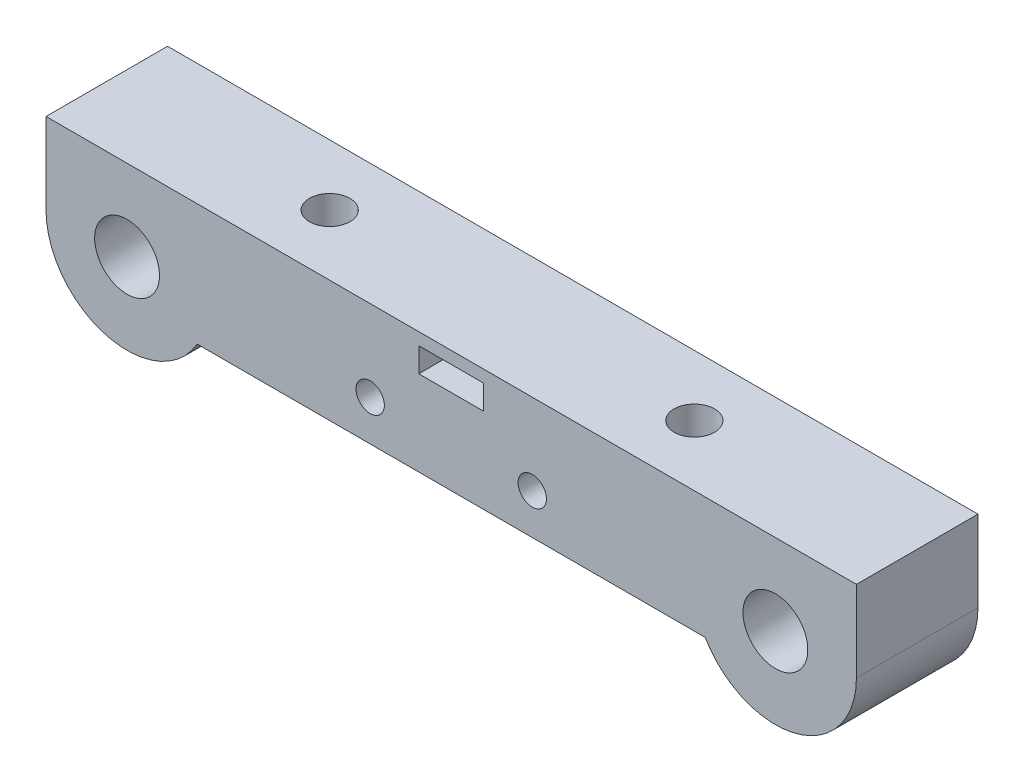
ISO-10303-21;
HEADER;
FILE_DESCRIPTION(('STEP AP214'),'2;1');
FILE_NAME('part.step','',(''),(''),'','','');
FILE_SCHEMA(('AUTOMOTIVE_DESIGN { 1 0 10303 214 1 1 1 1 }'));
ENDSEC;
DATA;
#1=APPLICATION_CONTEXT('core data for automotive mechanical design processes');
#2=APPLICATION_PROTOCOL_DEFINITION('international standard','automotive_design',2000,#1);
#3=PRODUCT_CONTEXT('',#1,'mechanical');
#4=PRODUCT('Part','Part','',(#3));
#5=PRODUCT_RELATED_PRODUCT_CATEGORY('part','',(#4));
#6=PRODUCT_DEFINITION_FORMATION('','',#4);
#7=PRODUCT_DEFINITION_CONTEXT('part definition',#1,'design');
#8=PRODUCT_DEFINITION('design','',#6,#7);
#9=PRODUCT_DEFINITION_SHAPE('','',#8);
#10=(LENGTH_UNIT() NAMED_UNIT(*) SI_UNIT(.MILLI.,.METRE.));
#11=(NAMED_UNIT(*) PLANE_ANGLE_UNIT() SI_UNIT($,.RADIAN.));
#12=(NAMED_UNIT(*) SI_UNIT($,.STERADIAN.) SOLID_ANGLE_UNIT());
#13=UNCERTAINTY_MEASURE_WITH_UNIT(LENGTH_MEASURE(1.E-05),#10,'distance_accuracy_value','');
#14=(GEOMETRIC_REPRESENTATION_CONTEXT(3) GLOBAL_UNCERTAINTY_ASSIGNED_CONTEXT((#13)) GLOBAL_UNIT_ASSIGNED_CONTEXT((#10,
#11,#12)) REPRESENTATION_CONTEXT('',''));
#15=CARTESIAN_POINT('',(0.,0.,0.));
#16=DIRECTION('',(0.,0.,1.));
#17=DIRECTION('',(1.,0.,0.));
#18=AXIS2_PLACEMENT_3D('',#15,#16,#17);
#19=CARTESIAN_POINT('',(40.,-9.99999999999999,15.));
#20=DIRECTION('',(0.,0.,-1.));
#21=DIRECTION('',(-1.,0.,0.));
#22=AXIS2_PLACEMENT_3D('',#19,#20,#21);
#23=PLANE('',#22);
#24=DIRECTION('',(-1.,0.,0.));
#25=VECTOR('',#24,1.);
#26=CARTESIAN_POINT('',(-50.,0.,15.));
#27=LINE('',#26,#25);
#28=CARTESIAN_POINT('',(50.,0.,15.));
#29=VERTEX_POINT('',#28);
#30=CARTESIAN_POINT('',(-50.,0.,15.));
#31=VERTEX_POINT('',#30);
#32=EDGE_CURVE('E149',#29,#31,#27,.T.);
#33=ORIENTED_EDGE('',*,*,#32,.T.);
#34=DIRECTION('',(0.,-1.,0.));
#35=VECTOR('',#34,1.);
#36=CARTESIAN_POINT('',(-50.,-10.,15.));
#37=LINE('',#36,#35);
#38=CARTESIAN_POINT('',(-50.,-10.,15.));
#39=VERTEX_POINT('',#38);
#40=EDGE_CURVE('E152',#31,#39,#37,.T.);
#41=ORIENTED_EDGE('',*,*,#40,.T.);
#42=CARTESIAN_POINT('',(-40.,-10.,15.));
#43=DIRECTION('',(0.,0.,1.));
#44=DIRECTION('',(1.,0.,0.));
#45=AXIS2_PLACEMENT_3D('',#42,#43,#44);
#46=CIRCLE('',#45,10.);
#47=CARTESIAN_POINT('',(-31.3397459621556,-15.,15.));
#48=VERTEX_POINT('',#47);
#49=EDGE_CURVE('E155',#39,#48,#46,.T.);
#50=ORIENTED_EDGE('',*,*,#49,.T.);
#51=DIRECTION('',(1.,0.,0.));
#52=VECTOR('',#51,1.);
#53=CARTESIAN_POINT('',(-31.3397459621556,-15.,15.));
#54=LINE('',#53,#52);
#55=CARTESIAN_POINT('',(31.3397459621556,-15.,15.));
#56=VERTEX_POINT('',#55);
#57=EDGE_CURVE('E157',#48,#56,#54,.T.);
#58=ORIENTED_EDGE('',*,*,#57,.T.);
#59=CARTESIAN_POINT('',(40.,-9.99999999999999,15.));
#60=DIRECTION('',(0.,0.,1.));
#61=DIRECTION('',(-1.,0.,0.));
#62=AXIS2_PLACEMENT_3D('',#59,#60,#61);
#63=CIRCLE('',#62,10.);
#64=CARTESIAN_POINT('',(50.,-9.99999999999999,15.));
#65=VERTEX_POINT('',#64);
#66=EDGE_CURVE('E159',#56,#65,#63,.T.);
#67=ORIENTED_EDGE('',*,*,#66,.T.);
#68=DIRECTION('',(0.,1.,0.));
#69=VECTOR('',#68,1.);
#70=CARTESIAN_POINT('',(50.,0.,15.));
#71=LINE('',#70,#69);
#72=EDGE_CURVE('E161',#65,#29,#71,.T.);
#73=ORIENTED_EDGE('',*,*,#72,.T.);
#74=EDGE_LOOP('',(#33,#41,#50,#58,#67,#73));
#75=FACE_BOUND('',#74,.T.);
#76=DIRECTION('',(0.,-1.,0.));
#77=VECTOR('',#76,1.);
#78=CARTESIAN_POINT('',(-4.,-1.5,15.));
#79=LINE('',#78,#77);
#80=CARTESIAN_POINT('',(-4.,-1.5,15.));
#81=VERTEX_POINT('',#80);
#82=CARTESIAN_POINT('',(-4.,-4.5,15.));
#83=VERTEX_POINT('',#82);
#84=EDGE_CURVE('E110',#81,#83,#79,.T.);
#85=ORIENTED_EDGE('',*,*,#84,.F.);
#86=DIRECTION('',(-1.,0.,0.));
#87=VECTOR('',#86,1.);
#88=CARTESIAN_POINT('',(4.,-1.5,15.));
#89=LINE('',#88,#87);
#90=CARTESIAN_POINT('',(4.,-1.5,15.));
#91=VERTEX_POINT('',#90);
#92=EDGE_CURVE('E133',#91,#81,#89,.T.);
#93=ORIENTED_EDGE('',*,*,#92,.F.);
#94=DIRECTION('',(0.,1.,0.));
#95=VECTOR('',#94,1.);
#96=CARTESIAN_POINT('',(4.,-1.5,15.));
#97=LINE('',#96,#95);
#98=CARTESIAN_POINT('',(4.,-4.5,15.));
#99=VERTEX_POINT('',#98);
#100=EDGE_CURVE('E131',#99,#91,#97,.T.);
#101=ORIENTED_EDGE('',*,*,#100,.F.);
#102=DIRECTION('',(1.,0.,0.));
#103=VECTOR('',#102,1.);
#104=CARTESIAN_POINT('',(4.,-4.5,15.));
#105=LINE('',#104,#103);
#106=EDGE_CURVE('E118',#83,#99,#105,.T.);
#107=ORIENTED_EDGE('',*,*,#106,.F.);
#108=EDGE_LOOP('',(#85,#93,#101,#107));
#109=FACE_BOUND('',#108,.T.);
#110=CARTESIAN_POINT('',(-40.,-10.,15.));
#111=DIRECTION('',(0.,0.,1.));
#112=DIRECTION('',(1.,0.,0.));
#113=AXIS2_PLACEMENT_3D('',#110,#111,#112);
#114=CIRCLE('',#113,4.);
#115=CARTESIAN_POINT('',(-36.,-10.,15.));
#116=VERTEX_POINT('',#115);
#117=EDGE_CURVE('E139',#116,#116,#114,.T.);
#118=ORIENTED_EDGE('',*,*,#117,.F.);
#119=EDGE_LOOP('',(#118));
#120=FACE_BOUND('',#119,.T.);
#121=CARTESIAN_POINT('',(40.,-9.99999999999999,15.));
#122=DIRECTION('',(0.,0.,1.));
#123=DIRECTION('',(-1.,0.,0.));
#124=AXIS2_PLACEMENT_3D('',#121,#122,#123);
#125=CIRCLE('',#124,4.);
#126=CARTESIAN_POINT('',(36.,-9.99999999999999,15.));
#127=VERTEX_POINT('',#126);
#128=EDGE_CURVE('E297',#127,#127,#125,.T.);
#129=ORIENTED_EDGE('',*,*,#128,.F.);
#130=EDGE_LOOP('',(#129));
#131=FACE_BOUND('',#130,.T.);
#132=CARTESIAN_POINT('',(10.,-10.,15.));
#133=DIRECTION('',(0.,0.,1.));
#134=DIRECTION('',(1.,0.,0.));
#135=AXIS2_PLACEMENT_3D('',#132,#133,#134);
#136=CIRCLE('',#135,1.75);
#137=CARTESIAN_POINT('',(11.75,-10.,15.));
#138=VERTEX_POINT('',#137);
#139=EDGE_CURVE('E291',#138,#138,#136,.T.);
#140=ORIENTED_EDGE('',*,*,#139,.F.);
#141=EDGE_LOOP('',(#140));
#142=FACE_BOUND('',#141,.T.);
#143=CARTESIAN_POINT('',(-10.,-10.,15.));
#144=DIRECTION('',(0.,0.,1.));
#145=DIRECTION('',(1.,0.,0.));
#146=AXIS2_PLACEMENT_3D('',#143,#144,#145);
#147=CIRCLE('',#146,1.75);
#148=CARTESIAN_POINT('',(-8.25,-10.,15.));
#149=VERTEX_POINT('',#148);
#150=EDGE_CURVE('E285',#149,#149,#147,.T.);
#151=ORIENTED_EDGE('',*,*,#150,.F.);
#152=EDGE_LOOP('',(#151));
#153=FACE_BOUND('',#152,.T.);
#154=ADVANCED_FACE('F33',(#75,#109,#120,#131,#142,#153),#23,.F.);
#155=CARTESIAN_POINT('',(40.,-9.99999999999999,0.));
#156=DIRECTION('',(0.,0.,-1.));
#157=DIRECTION('',(-1.,0.,0.));
#158=AXIS2_PLACEMENT_3D('',#155,#156,#157);
#159=PLANE('',#158);
#160=CARTESIAN_POINT('',(10.,-10.,0.));
#161=DIRECTION('',(0.,0.,1.));
#162=DIRECTION('',(1.,0.,0.));
#163=AXIS2_PLACEMENT_3D('',#160,#161,#162);
#164=CIRCLE('',#163,1.75);
#165=CARTESIAN_POINT('',(11.75,-10.,0.));
#166=VERTEX_POINT('',#165);
#167=EDGE_CURVE('E288',#166,#166,#164,.T.);
#168=ORIENTED_EDGE('',*,*,#167,.T.);
#169=EDGE_LOOP('',(#168));
#170=FACE_BOUND('',#169,.T.);
#171=CARTESIAN_POINT('',(-40.,-10.,0.));
#172=DIRECTION('',(0.,0.,1.));
#173=DIRECTION('',(1.,0.,0.));
#174=AXIS2_PLACEMENT_3D('',#171,#172,#173);
#175=CIRCLE('',#174,4.);
#176=CARTESIAN_POINT('',(-36.,-10.,0.));
#177=VERTEX_POINT('',#176);
#178=EDGE_CURVE('E300',#177,#177,#175,.T.);
#179=ORIENTED_EDGE('',*,*,#178,.T.);
#180=EDGE_LOOP('',(#179));
#181=FACE_BOUND('',#180,.T.);
#182=DIRECTION('',(-1.,0.,0.));
#183=VECTOR('',#182,1.);
#184=CARTESIAN_POINT('',(-50.,0.,0.));
#185=LINE('',#184,#183);
#186=CARTESIAN_POINT('',(50.,0.,0.));
#187=VERTEX_POINT('',#186);
#188=CARTESIAN_POINT('',(-50.,0.,0.));
#189=VERTEX_POINT('',#188);
#190=EDGE_CURVE('E126',#187,#189,#185,.T.);
#191=ORIENTED_EDGE('',*,*,#190,.F.);
#192=DIRECTION('',(0.,1.,0.));
#193=VECTOR('',#192,1.);
#194=CARTESIAN_POINT('',(50.,0.,0.));
#195=LINE('',#194,#193);
#196=CARTESIAN_POINT('',(50.,-9.99999999999999,0.));
#197=VERTEX_POINT('',#196);
#198=EDGE_CURVE('E153',#197,#187,#195,.T.);
#199=ORIENTED_EDGE('',*,*,#198,.F.);
#200=CARTESIAN_POINT('',(40.,-9.99999999999999,0.));
#201=DIRECTION('',(0.,0.,1.));
#202=DIRECTION('',(-1.,0.,0.));
#203=AXIS2_PLACEMENT_3D('',#200,#201,#202);
#204=CIRCLE('',#203,10.);
#205=CARTESIAN_POINT('',(31.3397459621556,-15.,0.));
#206=VERTEX_POINT('',#205);
#207=EDGE_CURVE('E172',#206,#197,#204,.T.);
#208=ORIENTED_EDGE('',*,*,#207,.F.);
#209=DIRECTION('',(1.,0.,0.));
#210=VECTOR('',#209,1.);
#211=CARTESIAN_POINT('',(-31.3397459621556,-15.,0.));
#212=LINE('',#211,#210);
#213=CARTESIAN_POINT('',(-31.3397459621556,-15.,0.));
#214=VERTEX_POINT('',#213);
#215=EDGE_CURVE('E170',#214,#206,#212,.T.);
#216=ORIENTED_EDGE('',*,*,#215,.F.);
#217=CARTESIAN_POINT('',(-40.,-10.,0.));
#218=DIRECTION('',(0.,0.,1.));
#219=DIRECTION('',(1.,0.,0.));
#220=AXIS2_PLACEMENT_3D('',#217,#218,#219);
#221=CIRCLE('',#220,10.);
#222=CARTESIAN_POINT('',(-50.,-10.,0.));
#223=VERTEX_POINT('',#222);
#224=EDGE_CURVE('E168',#223,#214,#221,.T.);
#225=ORIENTED_EDGE('',*,*,#224,.F.);
#226=DIRECTION('',(0.,-1.,0.));
#227=VECTOR('',#226,1.);
#228=CARTESIAN_POINT('',(-50.,-10.,0.));
#229=LINE('',#228,#227);
#230=EDGE_CURVE('E166',#189,#223,#229,.T.);
#231=ORIENTED_EDGE('',*,*,#230,.F.);
#232=EDGE_LOOP('',(#191,#199,#208,#216,#225,#231));
#233=FACE_BOUND('',#232,.T.);
#234=DIRECTION('',(-1.,0.,0.));
#235=VECTOR('',#234,1.);
#236=CARTESIAN_POINT('',(4.,-1.5,0.));
#237=LINE('',#236,#235);
#238=CARTESIAN_POINT('',(4.,-1.5,0.));
#239=VERTEX_POINT('',#238);
#240=CARTESIAN_POINT('',(-4.,-1.5,0.));
#241=VERTEX_POINT('',#240);
#242=EDGE_CURVE('E119',#239,#241,#237,.T.);
#243=ORIENTED_EDGE('',*,*,#242,.T.);
#244=DIRECTION('',(0.,-1.,0.));
#245=VECTOR('',#244,1.);
#246=CARTESIAN_POINT('',(-4.,-1.5,0.));
#247=LINE('',#246,#245);
#248=CARTESIAN_POINT('',(-4.,-4.5,0.));
#249=VERTEX_POINT('',#248);
#250=EDGE_CURVE('E56',#241,#249,#247,.T.);
#251=ORIENTED_EDGE('',*,*,#250,.T.);
#252=DIRECTION('',(1.,0.,0.));
#253=VECTOR('',#252,1.);
#254=CARTESIAN_POINT('',(4.,-4.5,0.));
#255=LINE('',#254,#253);
#256=CARTESIAN_POINT('',(4.,-4.5,0.));
#257=VERTEX_POINT('',#256);
#258=EDGE_CURVE('E125',#249,#257,#255,.T.);
#259=ORIENTED_EDGE('',*,*,#258,.T.);
#260=DIRECTION('',(0.,1.,0.));
#261=VECTOR('',#260,1.);
#262=CARTESIAN_POINT('',(4.,-1.5,0.));
#263=LINE('',#262,#261);
#264=EDGE_CURVE('E141',#257,#239,#263,.T.);
#265=ORIENTED_EDGE('',*,*,#264,.T.);
#266=EDGE_LOOP('',(#243,#251,#259,#265));
#267=FACE_BOUND('',#266,.T.);
#268=CARTESIAN_POINT('',(40.,-9.99999999999999,0.));
#269=DIRECTION('',(0.,0.,1.));
#270=DIRECTION('',(-1.,0.,0.));
#271=AXIS2_PLACEMENT_3D('',#268,#269,#270);
#272=CIRCLE('',#271,4.);
#273=CARTESIAN_POINT('',(36.,-9.99999999999999,0.));
#274=VERTEX_POINT('',#273);
#275=EDGE_CURVE('E294',#274,#274,#272,.T.);
#276=ORIENTED_EDGE('',*,*,#275,.T.);
#277=EDGE_LOOP('',(#276));
#278=FACE_BOUND('',#277,.T.);
#279=CARTESIAN_POINT('',(-10.,-10.,0.));
#280=DIRECTION('',(0.,0.,1.));
#281=DIRECTION('',(1.,0.,0.));
#282=AXIS2_PLACEMENT_3D('',#279,#280,#281);
#283=CIRCLE('',#282,1.75);
#284=CARTESIAN_POINT('',(-8.25,-10.,0.));
#285=VERTEX_POINT('',#284);
#286=EDGE_CURVE('E283',#285,#285,#283,.T.);
#287=ORIENTED_EDGE('',*,*,#286,.T.);
#288=EDGE_LOOP('',(#287));
#289=FACE_BOUND('',#288,.T.);
#290=ADVANCED_FACE('F196',(#170,#181,#233,#267,#278,#289),#159,.T.);
#291=CARTESIAN_POINT('',(-50.,0.,15.));
#292=DIRECTION('',(0.,-1.,0.));
#293=DIRECTION('',(1.,0.,0.));
#294=AXIS2_PLACEMENT_3D('',#291,#292,#293);
#295=PLANE('',#294);
#296=CARTESIAN_POINT('',(-22.5,0.,7.5));
#297=DIRECTION('',(0.,-1.,0.));
#298=DIRECTION('',(1.,0.,0.));
#299=AXIS2_PLACEMENT_3D('',#296,#297,#298);
#300=CIRCLE('',#299,2.5);
#301=CARTESIAN_POINT('',(-20.,0.,7.5));
#302=VERTEX_POINT('',#301);
#303=EDGE_CURVE('E270',#302,#302,#300,.T.);
#304=ORIENTED_EDGE('',*,*,#303,.T.);
#305=EDGE_LOOP('',(#304));
#306=FACE_BOUND('',#305,.T.);
#307=CARTESIAN_POINT('',(22.5,0.,7.5));
#308=DIRECTION('',(0.,-1.,0.));
#309=DIRECTION('',(1.,0.,0.));
#310=AXIS2_PLACEMENT_3D('',#307,#308,#309);
#311=CIRCLE('',#310,2.5);
#312=CARTESIAN_POINT('',(25.,0.,7.5));
#313=VERTEX_POINT('',#312);
#314=EDGE_CURVE('E278',#313,#313,#311,.F.);
#315=ORIENTED_EDGE('',*,*,#314,.F.);
#316=EDGE_LOOP('',(#315));
#317=FACE_BOUND('',#316,.T.);
#318=ORIENTED_EDGE('',*,*,#190,.T.);
#319=DIRECTION('',(0.,0.,-1.));
#320=VECTOR('',#319,1.);
#321=CARTESIAN_POINT('',(-50.,0.,15.));
#322=LINE('',#321,#320);
#323=EDGE_CURVE('E11',#31,#189,#322,.T.);
#324=ORIENTED_EDGE('',*,*,#323,.F.);
#325=ORIENTED_EDGE('',*,*,#32,.F.);
#326=DIRECTION('',(0.,0.,-1.));
#327=VECTOR('',#326,1.);
#328=CARTESIAN_POINT('',(50.,0.,15.));
#329=LINE('',#328,#327);
#330=EDGE_CURVE('E163',#29,#187,#329,.T.);
#331=ORIENTED_EDGE('',*,*,#330,.T.);
#332=EDGE_LOOP('',(#318,#324,#325,#331));
#333=FACE_BOUND('',#332,.T.);
#334=ADVANCED_FACE('F35',(#306,#317,#333),#295,.F.);
#335=CARTESIAN_POINT('',(-50.,-10.,15.));
#336=DIRECTION('',(1.,0.,0.));
#337=DIRECTION('',(0.,0.,-1.));
#338=AXIS2_PLACEMENT_3D('',#335,#336,#337);
#339=PLANE('',#338);
#340=ORIENTED_EDGE('',*,*,#230,.T.);
#341=DIRECTION('',(0.,0.,-1.));
#342=VECTOR('',#341,1.);
#343=CARTESIAN_POINT('',(-50.,-10.,15.));
#344=LINE('',#343,#342);
#345=EDGE_CURVE('E41',#39,#223,#344,.T.);
#346=ORIENTED_EDGE('',*,*,#345,.F.);
#347=ORIENTED_EDGE('',*,*,#40,.F.);
#348=ORIENTED_EDGE('',*,*,#323,.T.);
#349=EDGE_LOOP('',(#340,#346,#347,#348));
#350=FACE_BOUND('',#349,.T.);
#351=ADVANCED_FACE('F213',(#350),#339,.F.);
#352=CARTESIAN_POINT('',(-40.,-10.,15.));
#353=DIRECTION('',(0.,0.,-1.));
#354=DIRECTION('',(-1.,0.,0.));
#355=AXIS2_PLACEMENT_3D('',#352,#353,#354);
#356=CYLINDRICAL_SURFACE('',#355,10.);
#357=ORIENTED_EDGE('',*,*,#224,.T.);
#358=DIRECTION('',(0.,0.,-1.));
#359=VECTOR('',#358,1.);
#360=CARTESIAN_POINT('',(-31.3397459621556,-15.,15.));
#361=LINE('',#360,#359);
#362=EDGE_CURVE('E183',#48,#214,#361,.T.);
#363=ORIENTED_EDGE('',*,*,#362,.F.);
#364=ORIENTED_EDGE('',*,*,#49,.F.);
#365=ORIENTED_EDGE('',*,*,#345,.T.);
#366=EDGE_LOOP('',(#357,#363,#364,#365));
#367=FACE_BOUND('',#366,.T.);
#368=ADVANCED_FACE('F190',(#367),#356,.T.);
#369=CARTESIAN_POINT('',(-31.3397459621556,-15.,15.));
#370=DIRECTION('',(0.,1.,0.));
#371=DIRECTION('',(-1.,0.,0.));
#372=AXIS2_PLACEMENT_3D('',#369,#370,#371);
#373=PLANE('',#372);
#374=CARTESIAN_POINT('',(-22.5,-15.,7.5));
#375=DIRECTION('',(0.,-1.,0.));
#376=DIRECTION('',(1.,0.,0.));
#377=AXIS2_PLACEMENT_3D('',#374,#375,#376);
#378=CIRCLE('',#377,2.5);
#379=CARTESIAN_POINT('',(-20.,-15.,7.5));
#380=VERTEX_POINT('',#379);
#381=EDGE_CURVE('E273',#380,#380,#378,.T.);
#382=ORIENTED_EDGE('',*,*,#381,.F.);
#383=EDGE_LOOP('',(#382));
#384=FACE_BOUND('',#383,.T.);
#385=CARTESIAN_POINT('',(22.5,-15.,7.5));
#386=DIRECTION('',(0.,-1.,0.));
#387=DIRECTION('',(1.,0.,0.));
#388=AXIS2_PLACEMENT_3D('',#385,#386,#387);
#389=CIRCLE('',#388,2.5);
#390=CARTESIAN_POINT('',(25.,-15.,7.5));
#391=VERTEX_POINT('',#390);
#392=EDGE_CURVE('E275',#391,#391,#389,.F.);
#393=ORIENTED_EDGE('',*,*,#392,.T.);
#394=EDGE_LOOP('',(#393));
#395=FACE_BOUND('',#394,.T.);
#396=ORIENTED_EDGE('',*,*,#215,.T.);
#397=DIRECTION('',(0.,0.,-1.));
#398=VECTOR('',#397,1.);
#399=CARTESIAN_POINT('',(31.3397459621556,-15.,15.));
#400=LINE('',#399,#398);
#401=EDGE_CURVE('E180',#56,#206,#400,.T.);
#402=ORIENTED_EDGE('',*,*,#401,.F.);
#403=ORIENTED_EDGE('',*,*,#57,.F.);
#404=ORIENTED_EDGE('',*,*,#362,.T.);
#405=EDGE_LOOP('',(#396,#402,#403,#404));
#406=FACE_BOUND('',#405,.T.);
#407=ADVANCED_FACE('F202',(#384,#395,#406),#373,.F.);
#408=CARTESIAN_POINT('',(40.,-9.99999999999999,15.));
#409=DIRECTION('',(0.,0.,-1.));
#410=DIRECTION('',(-1.,0.,0.));
#411=AXIS2_PLACEMENT_3D('',#408,#409,#410);
#412=CYLINDRICAL_SURFACE('',#411,10.);
#413=ORIENTED_EDGE('',*,*,#207,.T.);
#414=DIRECTION('',(0.,0.,-1.));
#415=VECTOR('',#414,1.);
#416=CARTESIAN_POINT('',(50.,-9.99999999999999,15.));
#417=LINE('',#416,#415);
#418=EDGE_CURVE('E177',#65,#197,#417,.T.);
#419=ORIENTED_EDGE('',*,*,#418,.F.);
#420=ORIENTED_EDGE('',*,*,#66,.F.);
#421=ORIENTED_EDGE('',*,*,#401,.T.);
#422=EDGE_LOOP('',(#413,#419,#420,#421));
#423=FACE_BOUND('',#422,.T.);
#424=ADVANCED_FACE('F206',(#423),#412,.T.);
#425=CARTESIAN_POINT('',(50.,0.,15.));
#426=DIRECTION('',(-1.,0.,0.));
#427=DIRECTION('',(0.,0.,1.));
#428=AXIS2_PLACEMENT_3D('',#425,#426,#427);
#429=PLANE('',#428);
#430=ORIENTED_EDGE('',*,*,#198,.T.);
#431=ORIENTED_EDGE('',*,*,#330,.F.);
#432=ORIENTED_EDGE('',*,*,#72,.F.);
#433=ORIENTED_EDGE('',*,*,#418,.T.);
#434=EDGE_LOOP('',(#430,#431,#432,#433));
#435=FACE_BOUND('',#434,.T.);
#436=ADVANCED_FACE('F216',(#435),#429,.F.);
#437=CARTESIAN_POINT('',(-4.,-1.5,15.));
#438=DIRECTION('',(1.,0.,0.));
#439=DIRECTION('',(0.,1.,0.));
#440=AXIS2_PLACEMENT_3D('',#437,#438,#439);
#441=PLANE('',#440);
#442=ORIENTED_EDGE('',*,*,#250,.F.);
#443=DIRECTION('',(0.,0.,-1.));
#444=VECTOR('',#443,1.);
#445=CARTESIAN_POINT('',(-4.,-1.5,15.));
#446=LINE('',#445,#444);
#447=EDGE_CURVE('E114',#81,#241,#446,.T.);
#448=ORIENTED_EDGE('',*,*,#447,.F.);
#449=ORIENTED_EDGE('',*,*,#84,.T.);
#450=DIRECTION('',(0.,0.,-1.));
#451=VECTOR('',#450,1.);
#452=CARTESIAN_POINT('',(-4.,-4.5,15.));
#453=LINE('',#452,#451);
#454=EDGE_CURVE('E113',#83,#249,#453,.T.);
#455=ORIENTED_EDGE('',*,*,#454,.T.);
#456=EDGE_LOOP('',(#442,#448,#449,#455));
#457=FACE_BOUND('',#456,.T.);
#458=ADVANCED_FACE('F112',(#457),#441,.T.);
#459=CARTESIAN_POINT('',(4.,-4.5,15.));
#460=DIRECTION('',(0.,1.,0.));
#461=DIRECTION('',(0.,0.,1.));
#462=AXIS2_PLACEMENT_3D('',#459,#460,#461);
#463=PLANE('',#462);
#464=ORIENTED_EDGE('',*,*,#258,.F.);
#465=ORIENTED_EDGE('',*,*,#454,.F.);
#466=ORIENTED_EDGE('',*,*,#106,.T.);
#467=DIRECTION('',(0.,0.,-1.));
#468=VECTOR('',#467,1.);
#469=CARTESIAN_POINT('',(4.,-4.5,15.));
#470=LINE('',#469,#468);
#471=EDGE_CURVE('E127',#99,#257,#470,.T.);
#472=ORIENTED_EDGE('',*,*,#471,.T.);
#473=EDGE_LOOP('',(#464,#465,#466,#472));
#474=FACE_BOUND('',#473,.T.);
#475=ADVANCED_FACE('F122',(#474),#463,.T.);
#476=CARTESIAN_POINT('',(4.,-1.5,15.));
#477=DIRECTION('',(-1.,0.,0.));
#478=DIRECTION('',(0.,-1.,0.));
#479=AXIS2_PLACEMENT_3D('',#476,#477,#478);
#480=PLANE('',#479);
#481=ORIENTED_EDGE('',*,*,#264,.F.);
#482=ORIENTED_EDGE('',*,*,#471,.F.);
#483=ORIENTED_EDGE('',*,*,#100,.T.);
#484=DIRECTION('',(0.,0.,-1.));
#485=VECTOR('',#484,1.);
#486=CARTESIAN_POINT('',(4.,-1.5,15.));
#487=LINE('',#486,#485);
#488=EDGE_CURVE('E48',#91,#239,#487,.T.);
#489=ORIENTED_EDGE('',*,*,#488,.T.);
#490=EDGE_LOOP('',(#481,#482,#483,#489));
#491=FACE_BOUND('',#490,.T.);
#492=ADVANCED_FACE('F235',(#491),#480,.T.);
#493=CARTESIAN_POINT('',(4.,-1.5,15.));
#494=DIRECTION('',(0.,-1.,0.));
#495=DIRECTION('',(1.,0.,0.));
#496=AXIS2_PLACEMENT_3D('',#493,#494,#495);
#497=PLANE('',#496);
#498=ORIENTED_EDGE('',*,*,#242,.F.);
#499=ORIENTED_EDGE('',*,*,#488,.F.);
#500=ORIENTED_EDGE('',*,*,#92,.T.);
#501=ORIENTED_EDGE('',*,*,#447,.T.);
#502=EDGE_LOOP('',(#498,#499,#500,#501));
#503=FACE_BOUND('',#502,.T.);
#504=ADVANCED_FACE('F238',(#503),#497,.T.);
#505=CARTESIAN_POINT('',(-40.,-10.,15.));
#506=DIRECTION('',(0.,0.,-1.));
#507=DIRECTION('',(-1.,0.,0.));
#508=AXIS2_PLACEMENT_3D('',#505,#506,#507);
#509=CYLINDRICAL_SURFACE('',#508,4.);
#510=ORIENTED_EDGE('',*,*,#117,.T.);
#511=EDGE_LOOP('',(#510));
#512=FACE_BOUND('',#511,.T.);
#513=ORIENTED_EDGE('',*,*,#178,.F.);
#514=EDGE_LOOP('',(#513));
#515=FACE_BOUND('',#514,.T.);
#516=ADVANCED_FACE('F242',(#512,#515),#509,.F.);
#517=CARTESIAN_POINT('',(40.,-9.99999999999999,15.));
#518=DIRECTION('',(0.,0.,-1.));
#519=DIRECTION('',(-1.,0.,0.));
#520=AXIS2_PLACEMENT_3D('',#517,#518,#519);
#521=CYLINDRICAL_SURFACE('',#520,4.);
#522=ORIENTED_EDGE('',*,*,#128,.T.);
#523=EDGE_LOOP('',(#522));
#524=FACE_BOUND('',#523,.T.);
#525=ORIENTED_EDGE('',*,*,#275,.F.);
#526=EDGE_LOOP('',(#525));
#527=FACE_BOUND('',#526,.T.);
#528=ADVANCED_FACE('F245',(#524,#527),#521,.F.);
#529=CARTESIAN_POINT('',(10.,-10.,15.));
#530=DIRECTION('',(0.,0.,-1.));
#531=DIRECTION('',(-1.,0.,0.));
#532=AXIS2_PLACEMENT_3D('',#529,#530,#531);
#533=CYLINDRICAL_SURFACE('',#532,1.75);
#534=ORIENTED_EDGE('',*,*,#139,.T.);
#535=EDGE_LOOP('',(#534));
#536=FACE_BOUND('',#535,.T.);
#537=ORIENTED_EDGE('',*,*,#167,.F.);
#538=EDGE_LOOP('',(#537));
#539=FACE_BOUND('',#538,.T.);
#540=ADVANCED_FACE('F249',(#536,#539),#533,.F.);
#541=CARTESIAN_POINT('',(-10.,-10.,15.));
#542=DIRECTION('',(0.,0.,-1.));
#543=DIRECTION('',(-1.,0.,0.));
#544=AXIS2_PLACEMENT_3D('',#541,#542,#543);
#545=CYLINDRICAL_SURFACE('',#544,1.75);
#546=ORIENTED_EDGE('',*,*,#150,.T.);
#547=EDGE_LOOP('',(#546));
#548=FACE_BOUND('',#547,.T.);
#549=ORIENTED_EDGE('',*,*,#286,.F.);
#550=EDGE_LOOP('',(#549));
#551=FACE_BOUND('',#550,.T.);
#552=ADVANCED_FACE('F253',(#548,#551),#545,.F.);
#553=CARTESIAN_POINT('',(22.5,0.,7.5));
#554=DIRECTION('',(0.,-1.,0.));
#555=DIRECTION('',(1.,0.,0.));
#556=AXIS2_PLACEMENT_3D('',#553,#554,#555);
#557=CYLINDRICAL_SURFACE('',#556,2.5);
#558=ORIENTED_EDGE('',*,*,#314,.T.);
#559=EDGE_LOOP('',(#558));
#560=FACE_BOUND('',#559,.T.);
#561=ORIENTED_EDGE('',*,*,#392,.F.);
#562=EDGE_LOOP('',(#561));
#563=FACE_BOUND('',#562,.T.);
#564=ADVANCED_FACE('F257',(#560,#563),#557,.F.);
#565=CARTESIAN_POINT('',(-22.5,0.,7.5));
#566=DIRECTION('',(0.,-1.,0.));
#567=DIRECTION('',(1.,0.,0.));
#568=AXIS2_PLACEMENT_3D('',#565,#566,#567);
#569=CYLINDRICAL_SURFACE('',#568,2.5);
#570=ORIENTED_EDGE('',*,*,#303,.F.);
#571=EDGE_LOOP('',(#570));
#572=FACE_BOUND('',#571,.T.);
#573=ORIENTED_EDGE('',*,*,#381,.T.);
#574=EDGE_LOOP('',(#573));
#575=FACE_BOUND('',#574,.T.);
#576=ADVANCED_FACE('F261',(#572,#575),#569,.F.);
#577=CLOSED_SHELL('',(#154,#290,#334,#351,#368,#407,#424,#436,#458,#475,#492,#504,#516,#528,
#540,#552,#564,#576));
#578=MANIFOLD_SOLID_BREP('B2',#577);
#579=ADVANCED_BREP_SHAPE_REPRESENTATION('',(#18,#578),#14);
#580=SHAPE_DEFINITION_REPRESENTATION(#9,#579);
ENDSEC;
END-ISO-10303-21;
